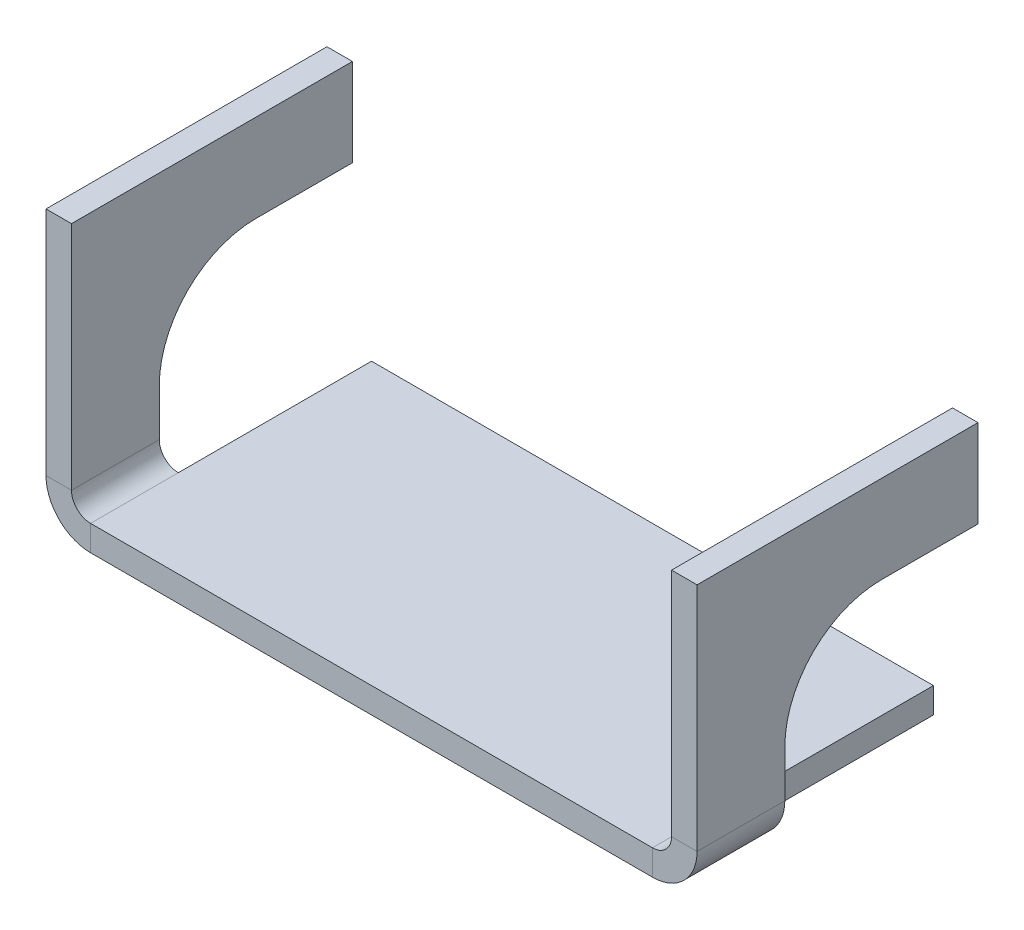
ISO-10303-21;
HEADER;
FILE_DESCRIPTION(('STEP AP214'),'2;1');
FILE_NAME('part.step','',(''),(''),'','','');
FILE_SCHEMA(('AUTOMOTIVE_DESIGN { 1 0 10303 214 1 1 1 1 }'));
ENDSEC;
DATA;
#1=APPLICATION_CONTEXT('core data for automotive mechanical design processes');
#2=APPLICATION_PROTOCOL_DEFINITION('international standard','automotive_design',2000,#1);
#3=PRODUCT_CONTEXT('',#1,'mechanical');
#4=PRODUCT('Part','Part','',(#3));
#5=PRODUCT_RELATED_PRODUCT_CATEGORY('part','',(#4));
#6=PRODUCT_DEFINITION_FORMATION('','',#4);
#7=PRODUCT_DEFINITION_CONTEXT('part definition',#1,'design');
#8=PRODUCT_DEFINITION('design','',#6,#7);
#9=PRODUCT_DEFINITION_SHAPE('','',#8);
#10=(LENGTH_UNIT() NAMED_UNIT(*) SI_UNIT(.MILLI.,.METRE.));
#11=(NAMED_UNIT(*) PLANE_ANGLE_UNIT() SI_UNIT($,.RADIAN.));
#12=(NAMED_UNIT(*) SI_UNIT($,.STERADIAN.) SOLID_ANGLE_UNIT());
#13=UNCERTAINTY_MEASURE_WITH_UNIT(LENGTH_MEASURE(1.E-05),#10,'distance_accuracy_value','');
#14=(GEOMETRIC_REPRESENTATION_CONTEXT(3) GLOBAL_UNCERTAINTY_ASSIGNED_CONTEXT((#13)) GLOBAL_UNIT_ASSIGNED_CONTEXT((#10,
#11,#12)) REPRESENTATION_CONTEXT('',''));
#15=CARTESIAN_POINT('',(0.,0.,0.));
#16=DIRECTION('',(0.,0.,1.));
#17=DIRECTION('',(1.,0.,0.));
#18=AXIS2_PLACEMENT_3D('',#15,#16,#17);
#19=CARTESIAN_POINT('',(47.033,0.,-5.467));
#20=DIRECTION('',(0.,-1.,0.));
#21=DIRECTION('',(0.,0.,-1.));
#22=AXIS2_PLACEMENT_3D('',#19,#20,#21);
#23=PLANE('',#22);
#24=DIRECTION('',(0.,0.,1.));
#25=VECTOR('',#24,1.);
#26=CARTESIAN_POINT('',(-35.,0.,-17.5));
#27=LINE('',#26,#25);
#28=CARTESIAN_POINT('',(-35.,0.,-17.5));
#29=VERTEX_POINT('',#28);
#30=CARTESIAN_POINT('',(-35.,0.,6.566));
#31=VERTEX_POINT('',#30);
#32=EDGE_CURVE('E318',#29,#31,#27,.T.);
#33=ORIENTED_EDGE('',*,*,#32,.T.);
#34=DIRECTION('',(0.,0.,1.));
#35=VECTOR('',#34,1.);
#36=CARTESIAN_POINT('',(-35.,0.,-5.46699999999999));
#37=LINE('',#36,#35);
#38=CARTESIAN_POINT('',(-35.,0.,17.5));
#39=VERTEX_POINT('',#38);
#40=EDGE_CURVE('E61',#31,#39,#37,.T.);
#41=ORIENTED_EDGE('',*,*,#40,.T.);
#42=DIRECTION('',(1.,0.,0.));
#43=VECTOR('',#42,1.);
#44=CARTESIAN_POINT('',(-70.,0.,17.5));
#45=LINE('',#44,#43);
#46=CARTESIAN_POINT('',(35.,0.,17.5));
#47=VERTEX_POINT('',#46);
#48=EDGE_CURVE('E298',#39,#47,#45,.T.);
#49=ORIENTED_EDGE('',*,*,#48,.T.);
#50=DIRECTION('',(0.,0.,1.));
#51=VECTOR('',#50,1.);
#52=CARTESIAN_POINT('',(35.,0.,-5.46700000000001));
#53=LINE('',#52,#51);
#54=CARTESIAN_POINT('',(35.,0.,6.566));
#55=VERTEX_POINT('',#54);
#56=EDGE_CURVE('E77',#55,#47,#53,.T.);
#57=ORIENTED_EDGE('',*,*,#56,.F.);
#58=DIRECTION('',(0.,0.,-1.));
#59=VECTOR('',#58,1.);
#60=CARTESIAN_POINT('',(35.,0.,-17.5));
#61=LINE('',#60,#59);
#62=CARTESIAN_POINT('',(35.,0.,-17.5));
#63=VERTEX_POINT('',#62);
#64=EDGE_CURVE('E312',#55,#63,#61,.T.);
#65=ORIENTED_EDGE('',*,*,#64,.T.);
#66=DIRECTION('',(-1.,0.,0.));
#67=VECTOR('',#66,1.);
#68=CARTESIAN_POINT('',(-35.,0.,-17.5));
#69=LINE('',#68,#67);
#70=EDGE_CURVE('E315',#63,#29,#69,.T.);
#71=ORIENTED_EDGE('',*,*,#70,.T.);
#72=EDGE_LOOP('',(#33,#41,#49,#57,#65,#71));
#73=FACE_BOUND('',#72,.T.);
#74=ADVANCED_FACE('F53',(#73),#23,.F.);
#75=CARTESIAN_POINT('',(47.033,-3.175,-5.467));
#76=DIRECTION('',(0.,-1.,0.));
#77=DIRECTION('',(0.,0.,-1.));
#78=AXIS2_PLACEMENT_3D('',#75,#76,#77);
#79=PLANE('',#78);
#80=DIRECTION('',(0.,0.,1.));
#81=VECTOR('',#80,1.);
#82=CARTESIAN_POINT('',(-35.,-3.175,-5.46699999999999));
#83=LINE('',#82,#81);
#84=CARTESIAN_POINT('',(-35.,-3.175,6.566));
#85=VERTEX_POINT('',#84);
#86=CARTESIAN_POINT('',(-35.,-3.175,17.5));
#87=VERTEX_POINT('',#86);
#88=EDGE_CURVE('E333',#85,#87,#83,.T.);
#89=ORIENTED_EDGE('',*,*,#88,.F.);
#90=DIRECTION('',(0.,0.,1.));
#91=VECTOR('',#90,1.);
#92=CARTESIAN_POINT('',(-35.,-3.175,-17.5));
#93=LINE('',#92,#91);
#94=CARTESIAN_POINT('',(-35.,-3.175,-17.5));
#95=VERTEX_POINT('',#94);
#96=EDGE_CURVE('E308',#95,#85,#93,.T.);
#97=ORIENTED_EDGE('',*,*,#96,.F.);
#98=DIRECTION('',(-1.,0.,0.));
#99=VECTOR('',#98,1.);
#100=CARTESIAN_POINT('',(-35.,-3.175,-17.5));
#101=LINE('',#100,#99);
#102=CARTESIAN_POINT('',(35.,-3.175,-17.5));
#103=VERTEX_POINT('',#102);
#104=EDGE_CURVE('E305',#103,#95,#101,.T.);
#105=ORIENTED_EDGE('',*,*,#104,.F.);
#106=DIRECTION('',(0.,0.,-1.));
#107=VECTOR('',#106,1.);
#108=CARTESIAN_POINT('',(35.,-3.175,-17.5));
#109=LINE('',#108,#107);
#110=CARTESIAN_POINT('',(35.,-3.175,6.566));
#111=VERTEX_POINT('',#110);
#112=EDGE_CURVE('E302',#111,#103,#109,.T.);
#113=ORIENTED_EDGE('',*,*,#112,.F.);
#114=DIRECTION('',(0.,0.,1.));
#115=VECTOR('',#114,1.);
#116=CARTESIAN_POINT('',(35.,-3.175,-5.46700000000001));
#117=LINE('',#116,#115);
#118=CARTESIAN_POINT('',(35.,-3.175,17.5));
#119=VERTEX_POINT('',#118);
#120=EDGE_CURVE('E323',#111,#119,#117,.T.);
#121=ORIENTED_EDGE('',*,*,#120,.T.);
#122=DIRECTION('',(1.,0.,0.));
#123=VECTOR('',#122,1.);
#124=CARTESIAN_POINT('',(-70.,-3.175,17.5));
#125=LINE('',#124,#123);
#126=EDGE_CURVE('E56',#87,#119,#125,.T.);
#127=ORIENTED_EDGE('',*,*,#126,.F.);
#128=EDGE_LOOP('',(#89,#97,#105,#113,#121,#127));
#129=FACE_BOUND('',#128,.T.);
#130=ADVANCED_FACE('F387',(#129),#79,.T.);
#131=CARTESIAN_POINT('',(-70.,-3.175,17.5));
#132=DIRECTION('',(0.,0.,1.));
#133=DIRECTION('',(1.,0.,0.));
#134=AXIS2_PLACEMENT_3D('',#131,#132,#133);
#135=PLANE('',#134);
#136=DIRECTION('',(0.,1.,0.));
#137=VECTOR('',#136,1.);
#138=CARTESIAN_POINT('',(-35.,-3.175,17.5));
#139=LINE('',#138,#137);
#140=EDGE_CURVE('E335',#87,#39,#139,.T.);
#141=ORIENTED_EDGE('',*,*,#140,.F.);
#142=ORIENTED_EDGE('',*,*,#126,.T.);
#143=DIRECTION('',(0.,1.,0.));
#144=VECTOR('',#143,1.);
#145=CARTESIAN_POINT('',(35.,-3.175,17.5));
#146=LINE('',#145,#144);
#147=EDGE_CURVE('E330',#119,#47,#146,.T.);
#148=ORIENTED_EDGE('',*,*,#147,.T.);
#149=ORIENTED_EDGE('',*,*,#48,.F.);
#150=EDGE_LOOP('',(#141,#142,#148,#149));
#151=FACE_BOUND('',#150,.T.);
#152=ADVANCED_FACE('F344',(#151),#135,.T.);
#153=CARTESIAN_POINT('',(-35.,-3.175,-17.5));
#154=DIRECTION('',(-1.,0.,0.));
#155=DIRECTION('',(0.,0.,1.));
#156=AXIS2_PLACEMENT_3D('',#153,#154,#155);
#157=PLANE('',#156);
#158=ORIENTED_EDGE('',*,*,#32,.F.);
#159=DIRECTION('',(0.,1.,0.));
#160=VECTOR('',#159,1.);
#161=CARTESIAN_POINT('',(-35.,-3.175,-17.5));
#162=LINE('',#161,#160);
#163=EDGE_CURVE('E321',#95,#29,#162,.T.);
#164=ORIENTED_EDGE('',*,*,#163,.F.);
#165=ORIENTED_EDGE('',*,*,#96,.T.);
#166=DIRECTION('',(0.,1.,0.));
#167=VECTOR('',#166,1.);
#168=CARTESIAN_POINT('',(-35.,-3.175,6.566));
#169=LINE('',#168,#167);
#170=EDGE_CURVE('E12',#85,#31,#169,.T.);
#171=ORIENTED_EDGE('',*,*,#170,.T.);
#172=EDGE_LOOP('',(#158,#164,#165,#171));
#173=FACE_BOUND('',#172,.T.);
#174=ADVANCED_FACE('F378',(#173),#157,.T.);
#175=CARTESIAN_POINT('',(-35.,-3.175,-17.5));
#176=DIRECTION('',(0.,0.,-1.));
#177=DIRECTION('',(-1.,0.,0.));
#178=AXIS2_PLACEMENT_3D('',#175,#176,#177);
#179=PLANE('',#178);
#180=ORIENTED_EDGE('',*,*,#70,.F.);
#181=DIRECTION('',(0.,1.,0.));
#182=VECTOR('',#181,1.);
#183=CARTESIAN_POINT('',(35.,-3.175,-17.5));
#184=LINE('',#183,#182);
#185=EDGE_CURVE('E311',#103,#63,#184,.T.);
#186=ORIENTED_EDGE('',*,*,#185,.F.);
#187=ORIENTED_EDGE('',*,*,#104,.T.);
#188=ORIENTED_EDGE('',*,*,#163,.T.);
#189=EDGE_LOOP('',(#180,#186,#187,#188));
#190=FACE_BOUND('',#189,.T.);
#191=ADVANCED_FACE('F374',(#190),#179,.T.);
#192=CARTESIAN_POINT('',(35.,-3.175,-17.5));
#193=DIRECTION('',(1.,0.,0.));
#194=DIRECTION('',(0.,0.,-1.));
#195=AXIS2_PLACEMENT_3D('',#192,#193,#194);
#196=PLANE('',#195);
#197=ORIENTED_EDGE('',*,*,#64,.F.);
#198=DIRECTION('',(0.,1.,0.));
#199=VECTOR('',#198,1.);
#200=CARTESIAN_POINT('',(35.,-3.175,6.566));
#201=LINE('',#200,#199);
#202=EDGE_CURVE('E327',#111,#55,#201,.T.);
#203=ORIENTED_EDGE('',*,*,#202,.F.);
#204=ORIENTED_EDGE('',*,*,#112,.T.);
#205=ORIENTED_EDGE('',*,*,#185,.T.);
#206=EDGE_LOOP('',(#197,#203,#204,#205));
#207=FACE_BOUND('',#206,.T.);
#208=ADVANCED_FACE('F370',(#207),#196,.T.);
#209=CARTESIAN_POINT('',(35.,2.380000066,6.566));
#210=DIRECTION('',(0.,0.,-1.));
#211=DIRECTION('',(-1.,0.,0.));
#212=AXIS2_PLACEMENT_3D('',#209,#210,#211);
#213=PLANE('',#212);
#214=ORIENTED_EDGE('',*,*,#202,.T.);
#215=CARTESIAN_POINT('',(35.,2.380000066,6.566));
#216=DIRECTION('',(0.,0.,1.));
#217=DIRECTION('',(1.,0.,0.));
#218=AXIS2_PLACEMENT_3D('',#215,#216,#217);
#219=CIRCLE('',#218,2.380000066);
#220=CARTESIAN_POINT('',(37.380000066,2.380000066,6.566));
#221=VERTEX_POINT('',#220);
#222=EDGE_CURVE('E238',#55,#221,#219,.T.);
#223=ORIENTED_EDGE('',*,*,#222,.T.);
#224=DIRECTION('',(1.,0.,0.));
#225=VECTOR('',#224,1.);
#226=CARTESIAN_POINT('',(40.555000066,2.38000006600002,6.566));
#227=LINE('',#226,#225);
#228=CARTESIAN_POINT('',(40.555000066,2.38000006600002,6.566));
#229=VERTEX_POINT('',#228);
#230=EDGE_CURVE('E283',#221,#229,#227,.T.);
#231=ORIENTED_EDGE('',*,*,#230,.T.);
#232=CARTESIAN_POINT('',(35.,2.380000066,6.566));
#233=DIRECTION('',(0.,0.,1.));
#234=DIRECTION('',(-1.,0.,0.));
#235=AXIS2_PLACEMENT_3D('',#232,#233,#234);
#236=CIRCLE('',#235,5.555000066);
#237=EDGE_CURVE('E291',#111,#229,#236,.T.);
#238=ORIENTED_EDGE('',*,*,#237,.F.);
#239=EDGE_LOOP('',(#214,#223,#231,#238));
#240=FACE_BOUND('',#239,.T.);
#241=ADVANCED_FACE('F365',(#240),#213,.T.);
#242=CARTESIAN_POINT('',(35.,2.380000066,17.5));
#243=DIRECTION('',(0.,0.,1.));
#244=DIRECTION('',(1.,0.,0.));
#245=AXIS2_PLACEMENT_3D('',#242,#243,#244);
#246=PLANE('',#245);
#247=DIRECTION('',(-1.,0.,0.));
#248=VECTOR('',#247,1.);
#249=CARTESIAN_POINT('',(40.555000066,2.38000006600002,17.5));
#250=LINE('',#249,#248);
#251=CARTESIAN_POINT('',(40.555000066,2.38000006600001,17.5));
#252=VERTEX_POINT('',#251);
#253=CARTESIAN_POINT('',(37.380000066,2.380000066,17.5));
#254=VERTEX_POINT('',#253);
#255=EDGE_CURVE('E286',#252,#254,#250,.T.);
#256=ORIENTED_EDGE('',*,*,#255,.T.);
#257=CARTESIAN_POINT('',(35.,2.380000066,17.5));
#258=DIRECTION('',(0.,0.,1.));
#259=DIRECTION('',(1.,0.,0.));
#260=AXIS2_PLACEMENT_3D('',#257,#258,#259);
#261=CIRCLE('',#260,2.380000066);
#262=EDGE_CURVE('E295',#254,#47,#261,.F.);
#263=ORIENTED_EDGE('',*,*,#262,.T.);
#264=ORIENTED_EDGE('',*,*,#147,.F.);
#265=CARTESIAN_POINT('',(35.,2.380000066,17.5));
#266=DIRECTION('',(0.,0.,-1.));
#267=DIRECTION('',(1.,0.,0.));
#268=AXIS2_PLACEMENT_3D('',#265,#266,#267);
#269=CIRCLE('',#268,5.555000066);
#270=EDGE_CURVE('E294',#252,#119,#269,.T.);
#271=ORIENTED_EDGE('',*,*,#270,.F.);
#272=EDGE_LOOP('',(#256,#263,#264,#271));
#273=FACE_BOUND('',#272,.T.);
#274=ADVANCED_FACE('F348',(#273),#246,.T.);
#275=CARTESIAN_POINT('',(35.,2.380000066,-0.946694981119614));
#276=DIRECTION('',(0.,0.,1.));
#277=DIRECTION('',(1.,0.,0.));
#278=AXIS2_PLACEMENT_3D('',#275,#276,#277);
#279=CYLINDRICAL_SURFACE('',#278,5.555000066);
#280=ORIENTED_EDGE('',*,*,#270,.T.);
#281=ORIENTED_EDGE('',*,*,#120,.F.);
#282=ORIENTED_EDGE('',*,*,#237,.T.);
#283=DIRECTION('',(0.,0.,1.));
#284=VECTOR('',#283,1.);
#285=CARTESIAN_POINT('',(40.555000066,2.38000006600002,-5.46700000000001));
#286=LINE('',#285,#284);
#287=EDGE_CURVE('E231',#229,#252,#286,.T.);
#288=ORIENTED_EDGE('',*,*,#287,.T.);
#289=EDGE_LOOP('',(#280,#281,#282,#288));
#290=FACE_BOUND('',#289,.T.);
#291=ADVANCED_FACE('F351',(#290),#279,.T.);
#292=CARTESIAN_POINT('',(35.,2.380000066,-0.946694981119614));
#293=DIRECTION('',(0.,0.,1.));
#294=DIRECTION('',(1.,0.,0.));
#295=AXIS2_PLACEMENT_3D('',#292,#293,#294);
#296=CYLINDRICAL_SURFACE('',#295,2.380000066);
#297=ORIENTED_EDGE('',*,*,#262,.F.);
#298=DIRECTION('',(0.,0.,1.));
#299=VECTOR('',#298,1.);
#300=CARTESIAN_POINT('',(37.380000066,2.380000066,-5.46700000000001));
#301=LINE('',#300,#299);
#302=EDGE_CURVE('E255',#221,#254,#301,.T.);
#303=ORIENTED_EDGE('',*,*,#302,.F.);
#304=ORIENTED_EDGE('',*,*,#222,.F.);
#305=ORIENTED_EDGE('',*,*,#56,.T.);
#306=EDGE_LOOP('',(#297,#303,#304,#305));
#307=FACE_BOUND('',#306,.T.);
#308=ADVANCED_FACE('F368',(#307),#296,.F.);
#309=CARTESIAN_POINT('',(40.5550000659999,31.1478655357687,-17.5));
#310=DIRECTION('',(0.,1.,0.));
#311=DIRECTION('',(0.,0.,-1.));
#312=AXIS2_PLACEMENT_3D('',#309,#310,#311);
#313=PLANE('',#312);
#314=DIRECTION('',(0.,0.,-1.));
#315=VECTOR('',#314,1.);
#316=CARTESIAN_POINT('',(37.3800000659999,31.1478655357687,-17.5));
#317=LINE('',#316,#315);
#318=CARTESIAN_POINT('',(37.3800000659999,31.1478655357687,17.5));
#319=VERTEX_POINT('',#318);
#320=CARTESIAN_POINT('',(37.3800000659999,31.1478655357687,-17.5));
#321=VERTEX_POINT('',#320);
#322=EDGE_CURVE('E250',#319,#321,#317,.T.);
#323=ORIENTED_EDGE('',*,*,#322,.F.);
#324=DIRECTION('',(-1.,0.,0.));
#325=VECTOR('',#324,1.);
#326=CARTESIAN_POINT('',(40.5550000659999,31.1478655357687,17.5));
#327=LINE('',#326,#325);
#328=CARTESIAN_POINT('',(40.5550000659999,31.1478655357687,17.5));
#329=VERTEX_POINT('',#328);
#330=EDGE_CURVE('E235',#329,#319,#327,.T.);
#331=ORIENTED_EDGE('',*,*,#330,.F.);
#332=DIRECTION('',(0.,0.,-1.));
#333=VECTOR('',#332,1.);
#334=CARTESIAN_POINT('',(40.5550000659999,31.1478655357687,-17.5));
#335=LINE('',#334,#333);
#336=CARTESIAN_POINT('',(40.5550000659999,31.1478655357687,-17.5));
#337=VERTEX_POINT('',#336);
#338=EDGE_CURVE('E280',#329,#337,#335,.T.);
#339=ORIENTED_EDGE('',*,*,#338,.T.);
#340=DIRECTION('',(-1.,0.,0.));
#341=VECTOR('',#340,1.);
#342=CARTESIAN_POINT('',(40.5550000659999,31.1478655357687,-17.5));
#343=LINE('',#342,#341);
#344=EDGE_CURVE('E278',#337,#321,#343,.T.);
#345=ORIENTED_EDGE('',*,*,#344,.T.);
#346=EDGE_LOOP('',(#323,#331,#339,#345));
#347=FACE_BOUND('',#346,.T.);
#348=ADVANCED_FACE('F474',(#347),#313,.T.);
#349=CARTESIAN_POINT('',(40.5550000659999,20.2138655357687,-17.5));
#350=DIRECTION('',(0.,0.,-1.));
#351=DIRECTION('',(0.,-1.,0.));
#352=AXIS2_PLACEMENT_3D('',#349,#350,#351);
#353=PLANE('',#352);
#354=DIRECTION('',(0.,-1.,0.));
#355=VECTOR('',#354,1.);
#356=CARTESIAN_POINT('',(37.3800000659999,20.2138655357687,-17.5));
#357=LINE('',#356,#355);
#358=CARTESIAN_POINT('',(37.3800000659999,20.2138655357687,-17.5));
#359=VERTEX_POINT('',#358);
#360=EDGE_CURVE('E247',#321,#359,#357,.T.);
#361=ORIENTED_EDGE('',*,*,#360,.F.);
#362=ORIENTED_EDGE('',*,*,#344,.F.);
#363=DIRECTION('',(0.,-1.,0.));
#364=VECTOR('',#363,1.);
#365=CARTESIAN_POINT('',(40.5550000659999,20.2138655357687,-17.5));
#366=LINE('',#365,#364);
#367=CARTESIAN_POINT('',(40.5550000659999,20.2138655357687,-17.5));
#368=VERTEX_POINT('',#367);
#369=EDGE_CURVE('E275',#337,#368,#366,.T.);
#370=ORIENTED_EDGE('',*,*,#369,.T.);
#371=DIRECTION('',(-1.,0.,0.));
#372=VECTOR('',#371,1.);
#373=CARTESIAN_POINT('',(40.5550000659999,20.2138655357687,-17.5));
#374=LINE('',#373,#372);
#375=EDGE_CURVE('E273',#368,#359,#374,.T.);
#376=ORIENTED_EDGE('',*,*,#375,.T.);
#377=EDGE_LOOP('',(#361,#362,#370,#376));
#378=FACE_BOUND('',#377,.T.);
#379=ADVANCED_FACE('F496',(#378),#353,.T.);
#380=CARTESIAN_POINT('',(40.5550000659999,20.2138655357687,-17.5));
#381=DIRECTION('',(0.,-1.,0.));
#382=DIRECTION('',(0.,0.,1.));
#383=AXIS2_PLACEMENT_3D('',#380,#381,#382);
#384=PLANE('',#383);
#385=DIRECTION('',(0.,0.,1.));
#386=VECTOR('',#385,1.);
#387=CARTESIAN_POINT('',(37.3800000659999,20.2138655357687,-17.5));
#388=LINE('',#387,#386);
#389=CARTESIAN_POINT('',(37.3800000659999,20.2138655357687,-5.46700000000001));
#390=VERTEX_POINT('',#389);
#391=EDGE_CURVE('E244',#359,#390,#388,.T.);
#392=ORIENTED_EDGE('',*,*,#391,.F.);
#393=ORIENTED_EDGE('',*,*,#375,.F.);
#394=DIRECTION('',(0.,0.,1.));
#395=VECTOR('',#394,1.);
#396=CARTESIAN_POINT('',(40.5550000659999,20.2138655357687,-17.5));
#397=LINE('',#396,#395);
#398=CARTESIAN_POINT('',(40.5550000659999,20.2138655357687,-5.46700000000001));
#399=VERTEX_POINT('',#398);
#400=EDGE_CURVE('E270',#368,#399,#397,.T.);
#401=ORIENTED_EDGE('',*,*,#400,.T.);
#402=DIRECTION('',(-1.,0.,0.));
#403=VECTOR('',#402,1.);
#404=CARTESIAN_POINT('',(40.5550000659999,20.2138655357687,-5.46700000000001));
#405=LINE('',#404,#403);
#406=EDGE_CURVE('E268',#399,#390,#405,.T.);
#407=ORIENTED_EDGE('',*,*,#406,.T.);
#408=EDGE_LOOP('',(#392,#393,#401,#407));
#409=FACE_BOUND('',#408,.T.);
#410=ADVANCED_FACE('F492',(#409),#384,.T.);
#411=CARTESIAN_POINT('',(40.555000066,8.1808655357687,-5.46700000000001));
#412=DIRECTION('',(-1.,0.,0.));
#413=DIRECTION('',(0.,0.,1.));
#414=AXIS2_PLACEMENT_3D('',#411,#412,#413);
#415=CYLINDRICAL_SURFACE('',#414,12.033);
#416=CARTESIAN_POINT('',(37.380000066,8.18086553576869,-5.46700000000001));
#417=DIRECTION('',(1.,0.,0.));
#418=DIRECTION('',(0.,0.,-1.));
#419=AXIS2_PLACEMENT_3D('',#416,#417,#418);
#420=CIRCLE('',#419,12.033);
#421=CARTESIAN_POINT('',(37.380000066,8.18086553576869,6.56599999999999));
#422=VERTEX_POINT('',#421);
#423=EDGE_CURVE('E241',#390,#422,#420,.T.);
#424=ORIENTED_EDGE('',*,*,#423,.F.);
#425=ORIENTED_EDGE('',*,*,#406,.F.);
#426=CARTESIAN_POINT('',(40.555000066,8.1808655357687,-5.46700000000001));
#427=DIRECTION('',(1.,0.,0.));
#428=DIRECTION('',(0.,0.,-1.));
#429=AXIS2_PLACEMENT_3D('',#426,#427,#428);
#430=CIRCLE('',#429,12.033);
#431=CARTESIAN_POINT('',(40.555000066,8.1808655357687,6.566));
#432=VERTEX_POINT('',#431);
#433=EDGE_CURVE('E265',#399,#432,#430,.T.);
#434=ORIENTED_EDGE('',*,*,#433,.T.);
#435=DIRECTION('',(-1.,0.,0.));
#436=VECTOR('',#435,1.);
#437=CARTESIAN_POINT('',(40.555000066,8.1808655357687,6.566));
#438=LINE('',#437,#436);
#439=EDGE_CURVE('E263',#432,#422,#438,.T.);
#440=ORIENTED_EDGE('',*,*,#439,.T.);
#441=EDGE_LOOP('',(#424,#425,#434,#440));
#442=FACE_BOUND('',#441,.T.);
#443=ADVANCED_FACE('F489',(#442),#415,.F.);
#444=CARTESIAN_POINT('',(40.555000066,8.1808655357687,-5.46700000000001));
#445=DIRECTION('',(1.,0.,0.));
#446=DIRECTION('',(0.,0.,-1.));
#447=AXIS2_PLACEMENT_3D('',#444,#445,#446);
#448=PLANE('',#447);
#449=ORIENTED_EDGE('',*,*,#287,.F.);
#450=DIRECTION('',(0.,-1.,0.));
#451=VECTOR('',#450,1.);
#452=CARTESIAN_POINT('',(40.555000066,-3.8521344642313,6.566));
#453=LINE('',#452,#451);
#454=EDGE_CURVE('E260',#432,#229,#453,.T.);
#455=ORIENTED_EDGE('',*,*,#454,.F.);
#456=ORIENTED_EDGE('',*,*,#433,.F.);
#457=ORIENTED_EDGE('',*,*,#400,.F.);
#458=ORIENTED_EDGE('',*,*,#369,.F.);
#459=ORIENTED_EDGE('',*,*,#338,.F.);
#460=DIRECTION('',(0.,1.,0.));
#461=VECTOR('',#460,1.);
#462=CARTESIAN_POINT('',(40.5550000660004,-108.852134464231,17.5));
#463=LINE('',#462,#461);
#464=EDGE_CURVE('E239',#252,#329,#463,.T.);
#465=ORIENTED_EDGE('',*,*,#464,.F.);
#466=EDGE_LOOP('',(#449,#455,#456,#457,#458,#459,#465));
#467=FACE_BOUND('',#466,.T.);
#468=ADVANCED_FACE('F356',(#467),#448,.T.);
#469=CARTESIAN_POINT('',(40.555000066,-3.8521344642313,6.566));
#470=DIRECTION('',(0.,0.,-1.));
#471=DIRECTION('',(0.,-1.,0.));
#472=AXIS2_PLACEMENT_3D('',#469,#470,#471);
#473=PLANE('',#472);
#474=ORIENTED_EDGE('',*,*,#230,.F.);
#475=DIRECTION('',(0.,-1.,0.));
#476=VECTOR('',#475,1.);
#477=CARTESIAN_POINT('',(37.380000066,-3.85213446423131,6.566));
#478=LINE('',#477,#476);
#479=EDGE_CURVE('E258',#422,#221,#478,.T.);
#480=ORIENTED_EDGE('',*,*,#479,.F.);
#481=ORIENTED_EDGE('',*,*,#439,.F.);
#482=ORIENTED_EDGE('',*,*,#454,.T.);
#483=EDGE_LOOP('',(#474,#480,#481,#482));
#484=FACE_BOUND('',#483,.T.);
#485=ADVANCED_FACE('F361',(#484),#473,.T.);
#486=CARTESIAN_POINT('',(37.380000066,8.18086553576869,-5.46700000000001));
#487=DIRECTION('',(1.,0.,0.));
#488=DIRECTION('',(0.,0.,-1.));
#489=AXIS2_PLACEMENT_3D('',#486,#487,#488);
#490=PLANE('',#489);
#491=ORIENTED_EDGE('',*,*,#479,.T.);
#492=ORIENTED_EDGE('',*,*,#302,.T.);
#493=DIRECTION('',(0.,1.,0.));
#494=VECTOR('',#493,1.);
#495=CARTESIAN_POINT('',(37.3800000660004,-108.852134464231,17.5));
#496=LINE('',#495,#494);
#497=EDGE_CURVE('E253',#254,#319,#496,.T.);
#498=ORIENTED_EDGE('',*,*,#497,.T.);
#499=ORIENTED_EDGE('',*,*,#322,.T.);
#500=ORIENTED_EDGE('',*,*,#360,.T.);
#501=ORIENTED_EDGE('',*,*,#391,.T.);
#502=ORIENTED_EDGE('',*,*,#423,.T.);
#503=EDGE_LOOP('',(#491,#492,#498,#499,#500,#501,#502));
#504=FACE_BOUND('',#503,.T.);
#505=ADVANCED_FACE('F480',(#504),#490,.F.);
#506=CARTESIAN_POINT('',(40.5550000660004,-108.852134464231,17.5));
#507=DIRECTION('',(0.,0.,1.));
#508=DIRECTION('',(0.,1.,0.));
#509=AXIS2_PLACEMENT_3D('',#506,#507,#508);
#510=PLANE('',#509);
#511=ORIENTED_EDGE('',*,*,#255,.F.);
#512=ORIENTED_EDGE('',*,*,#464,.T.);
#513=ORIENTED_EDGE('',*,*,#330,.T.);
#514=ORIENTED_EDGE('',*,*,#497,.F.);
#515=EDGE_LOOP('',(#511,#512,#513,#514));
#516=FACE_BOUND('',#515,.T.);
#517=ADVANCED_FACE('F477',(#516),#510,.T.);
#518=CARTESIAN_POINT('',(-35.,2.380000066,6.566));
#519=DIRECTION('',(0.,0.,-1.));
#520=DIRECTION('',(-1.,0.,0.));
#521=AXIS2_PLACEMENT_3D('',#518,#519,#520);
#522=PLANE('',#521);
#523=DIRECTION('',(-1.,0.,0.));
#524=VECTOR('',#523,1.);
#525=CARTESIAN_POINT('',(-40.555000066,2.38000006600002,6.566));
#526=LINE('',#525,#524);
#527=CARTESIAN_POINT('',(-37.380000066,2.380000066,6.566));
#528=VERTEX_POINT('',#527);
#529=CARTESIAN_POINT('',(-40.555000066,2.38000006600001,6.566));
#530=VERTEX_POINT('',#529);
#531=EDGE_CURVE('E199',#528,#530,#526,.T.);
#532=ORIENTED_EDGE('',*,*,#531,.F.);
#533=CARTESIAN_POINT('',(-35.,2.380000066,6.566));
#534=DIRECTION('',(0.,0.,-1.));
#535=DIRECTION('',(-1.,0.,0.));
#536=AXIS2_PLACEMENT_3D('',#533,#534,#535);
#537=CIRCLE('',#536,2.380000066);
#538=EDGE_CURVE('E69',#528,#31,#537,.F.);
#539=ORIENTED_EDGE('',*,*,#538,.T.);
#540=ORIENTED_EDGE('',*,*,#170,.F.);
#541=CARTESIAN_POINT('',(-35.,2.380000066,6.566));
#542=DIRECTION('',(0.,0.,1.));
#543=DIRECTION('',(-1.,0.,0.));
#544=AXIS2_PLACEMENT_3D('',#541,#542,#543);
#545=CIRCLE('',#544,5.555000066);
#546=EDGE_CURVE('E224',#530,#85,#545,.T.);
#547=ORIENTED_EDGE('',*,*,#546,.F.);
#548=EDGE_LOOP('',(#532,#539,#540,#547));
#549=FACE_BOUND('',#548,.T.);
#550=ADVANCED_FACE('F380',(#549),#522,.T.);
#551=CARTESIAN_POINT('',(-35.,2.380000066,17.5));
#552=DIRECTION('',(0.,0.,1.));
#553=DIRECTION('',(1.,0.,0.));
#554=AXIS2_PLACEMENT_3D('',#551,#552,#553);
#555=PLANE('',#554);
#556=CARTESIAN_POINT('',(-35.,2.380000066,17.5));
#557=DIRECTION('',(0.,0.,-1.));
#558=DIRECTION('',(-1.,0.,0.));
#559=AXIS2_PLACEMENT_3D('',#556,#557,#558);
#560=CIRCLE('',#559,2.380000066);
#561=CARTESIAN_POINT('',(-37.380000066,2.38000006600001,17.5));
#562=VERTEX_POINT('',#561);
#563=EDGE_CURVE('E228',#39,#562,#560,.T.);
#564=ORIENTED_EDGE('',*,*,#563,.T.);
#565=DIRECTION('',(1.,0.,0.));
#566=VECTOR('',#565,1.);
#567=CARTESIAN_POINT('',(-40.555000066,2.38000006600002,17.5));
#568=LINE('',#567,#566);
#569=CARTESIAN_POINT('',(-40.555000066,2.38000006600002,17.5));
#570=VERTEX_POINT('',#569);
#571=EDGE_CURVE('E415',#570,#562,#568,.T.);
#572=ORIENTED_EDGE('',*,*,#571,.F.);
#573=CARTESIAN_POINT('',(-35.,2.380000066,17.5));
#574=DIRECTION('',(0.,0.,-1.));
#575=DIRECTION('',(1.,0.,0.));
#576=AXIS2_PLACEMENT_3D('',#573,#574,#575);
#577=CIRCLE('',#576,5.555000066);
#578=EDGE_CURVE('E227',#87,#570,#577,.T.);
#579=ORIENTED_EDGE('',*,*,#578,.F.);
#580=ORIENTED_EDGE('',*,*,#140,.T.);
#581=EDGE_LOOP('',(#564,#572,#579,#580));
#582=FACE_BOUND('',#581,.T.);
#583=ADVANCED_FACE('F390',(#582),#555,.T.);
#584=CARTESIAN_POINT('',(-35.,2.380000066,25.0126949811196));
#585=DIRECTION('',(0.,0.,-1.));
#586=DIRECTION('',(-1.,0.,0.));
#587=AXIS2_PLACEMENT_3D('',#584,#585,#586);
#588=CYLINDRICAL_SURFACE('',#587,5.555000066);
#589=ORIENTED_EDGE('',*,*,#88,.T.);
#590=ORIENTED_EDGE('',*,*,#578,.T.);
#591=DIRECTION('',(0.,0.,1.));
#592=VECTOR('',#591,1.);
#593=CARTESIAN_POINT('',(-40.555000066,2.38000006600002,-5.467));
#594=LINE('',#593,#592);
#595=EDGE_CURVE('E385',#530,#570,#594,.T.);
#596=ORIENTED_EDGE('',*,*,#595,.F.);
#597=ORIENTED_EDGE('',*,*,#546,.T.);
#598=EDGE_LOOP('',(#589,#590,#596,#597));
#599=FACE_BOUND('',#598,.T.);
#600=ADVANCED_FACE('F383',(#599),#588,.T.);
#601=CARTESIAN_POINT('',(-35.,2.380000066,25.0126949811196));
#602=DIRECTION('',(0.,0.,-1.));
#603=DIRECTION('',(-1.,0.,0.));
#604=AXIS2_PLACEMENT_3D('',#601,#602,#603);
#605=CYLINDRICAL_SURFACE('',#604,2.380000066);
#606=ORIENTED_EDGE('',*,*,#40,.F.);
#607=ORIENTED_EDGE('',*,*,#538,.F.);
#608=DIRECTION('',(0.,0.,1.));
#609=VECTOR('',#608,1.);
#610=CARTESIAN_POINT('',(-37.380000066,2.380000066,-5.467));
#611=LINE('',#610,#609);
#612=EDGE_CURVE('E217',#528,#562,#611,.T.);
#613=ORIENTED_EDGE('',*,*,#612,.T.);
#614=ORIENTED_EDGE('',*,*,#563,.F.);
#615=EDGE_LOOP('',(#606,#607,#613,#614));
#616=FACE_BOUND('',#615,.T.);
#617=ADVANCED_FACE('F393',(#616),#605,.F.);
#618=CARTESIAN_POINT('',(-40.555000066,8.1808655357687,-5.46700000000001));
#619=DIRECTION('',(1.,0.,0.));
#620=DIRECTION('',(0.,0.,1.));
#621=AXIS2_PLACEMENT_3D('',#618,#619,#620);
#622=CYLINDRICAL_SURFACE('',#621,12.033);
#623=CARTESIAN_POINT('',(-37.380000066,8.18086553576869,-5.46700000000001));
#624=DIRECTION('',(-1.,0.,0.));
#625=DIRECTION('',(0.,0.,1.));
#626=AXIS2_PLACEMENT_3D('',#623,#624,#625);
#627=CIRCLE('',#626,12.033);
#628=CARTESIAN_POINT('',(-37.380000066,8.18086553576869,6.566));
#629=VERTEX_POINT('',#628);
#630=CARTESIAN_POINT('',(-37.3800000659999,20.2138655357687,-5.46700000000001));
#631=VERTEX_POINT('',#630);
#632=EDGE_CURVE('E209',#629,#631,#627,.T.);
#633=ORIENTED_EDGE('',*,*,#632,.F.);
#634=DIRECTION('',(1.,0.,0.));
#635=VECTOR('',#634,1.);
#636=CARTESIAN_POINT('',(-40.555000066,8.1808655357687,6.566));
#637=LINE('',#636,#635);
#638=CARTESIAN_POINT('',(-40.555000066,8.1808655357687,6.566));
#639=VERTEX_POINT('',#638);
#640=EDGE_CURVE('E197',#639,#629,#637,.T.);
#641=ORIENTED_EDGE('',*,*,#640,.F.);
#642=CARTESIAN_POINT('',(-40.555000066,8.1808655357687,-5.46700000000001));
#643=DIRECTION('',(-1.,0.,0.));
#644=DIRECTION('',(0.,0.,1.));
#645=AXIS2_PLACEMENT_3D('',#642,#643,#644);
#646=CIRCLE('',#645,12.033);
#647=CARTESIAN_POINT('',(-40.5550000659999,20.2138655357687,-5.46700000000001));
#648=VERTEX_POINT('',#647);
#649=EDGE_CURVE('E207',#639,#648,#646,.T.);
#650=ORIENTED_EDGE('',*,*,#649,.T.);
#651=DIRECTION('',(1.,0.,0.));
#652=VECTOR('',#651,1.);
#653=CARTESIAN_POINT('',(-40.5550000659999,20.2138655357687,-5.46700000000001));
#654=LINE('',#653,#652);
#655=EDGE_CURVE('E216',#648,#631,#654,.T.);
#656=ORIENTED_EDGE('',*,*,#655,.T.);
#657=EDGE_LOOP('',(#633,#641,#650,#656));
#658=FACE_BOUND('',#657,.T.);
#659=ADVANCED_FACE('F206',(#658),#622,.F.);
#660=CARTESIAN_POINT('',(-40.5550000659999,20.2138655357687,-17.5));
#661=DIRECTION('',(0.,-1.,0.));
#662=DIRECTION('',(0.,0.,-1.));
#663=AXIS2_PLACEMENT_3D('',#660,#661,#662);
#664=PLANE('',#663);
#665=DIRECTION('',(0.,0.,-1.));
#666=VECTOR('',#665,1.);
#667=CARTESIAN_POINT('',(-37.3800000659999,20.2138655357687,-17.5));
#668=LINE('',#667,#666);
#669=CARTESIAN_POINT('',(-37.3800000659999,20.2138655357687,-17.5));
#670=VERTEX_POINT('',#669);
#671=EDGE_CURVE('E410',#631,#670,#668,.T.);
#672=ORIENTED_EDGE('',*,*,#671,.F.);
#673=ORIENTED_EDGE('',*,*,#655,.F.);
#674=DIRECTION('',(0.,0.,-1.));
#675=VECTOR('',#674,1.);
#676=CARTESIAN_POINT('',(-40.5550000659999,20.2138655357687,-17.5));
#677=LINE('',#676,#675);
#678=CARTESIAN_POINT('',(-40.5550000659999,20.2138655357687,-17.5));
#679=VERTEX_POINT('',#678);
#680=EDGE_CURVE('E215',#648,#679,#677,.T.);
#681=ORIENTED_EDGE('',*,*,#680,.T.);
#682=DIRECTION('',(1.,0.,0.));
#683=VECTOR('',#682,1.);
#684=CARTESIAN_POINT('',(-40.5550000659999,20.2138655357687,-17.5));
#685=LINE('',#684,#683);
#686=EDGE_CURVE('E431',#679,#670,#685,.T.);
#687=ORIENTED_EDGE('',*,*,#686,.T.);
#688=EDGE_LOOP('',(#672,#673,#681,#687));
#689=FACE_BOUND('',#688,.T.);
#690=ADVANCED_FACE('F434',(#689),#664,.T.);
#691=CARTESIAN_POINT('',(-40.5550000659999,31.1478655357687,-17.5));
#692=DIRECTION('',(0.,0.,-1.));
#693=DIRECTION('',(0.,1.,0.));
#694=AXIS2_PLACEMENT_3D('',#691,#692,#693);
#695=PLANE('',#694);
#696=DIRECTION('',(0.,1.,0.));
#697=VECTOR('',#696,1.);
#698=CARTESIAN_POINT('',(-37.3800000659999,31.1478655357687,-17.5));
#699=LINE('',#698,#697);
#700=CARTESIAN_POINT('',(-37.3800000659999,31.1478655357687,-17.5));
#701=VERTEX_POINT('',#700);
#702=EDGE_CURVE('E407',#670,#701,#699,.T.);
#703=ORIENTED_EDGE('',*,*,#702,.F.);
#704=ORIENTED_EDGE('',*,*,#686,.F.);
#705=DIRECTION('',(0.,1.,0.));
#706=VECTOR('',#705,1.);
#707=CARTESIAN_POINT('',(-40.5550000659999,31.1478655357687,-17.5));
#708=LINE('',#707,#706);
#709=CARTESIAN_POINT('',(-40.5550000659999,31.1478655357687,-17.5));
#710=VERTEX_POINT('',#709);
#711=EDGE_CURVE('E428',#679,#710,#708,.T.);
#712=ORIENTED_EDGE('',*,*,#711,.T.);
#713=DIRECTION('',(1.,0.,0.));
#714=VECTOR('',#713,1.);
#715=CARTESIAN_POINT('',(-40.5550000659999,31.1478655357687,-17.5));
#716=LINE('',#715,#714);
#717=EDGE_CURVE('E426',#710,#701,#716,.T.);
#718=ORIENTED_EDGE('',*,*,#717,.T.);
#719=EDGE_LOOP('',(#703,#704,#712,#718));
#720=FACE_BOUND('',#719,.T.);
#721=ADVANCED_FACE('F439',(#720),#695,.T.);
#722=CARTESIAN_POINT('',(-40.5550000659999,31.1478655357687,-17.5));
#723=DIRECTION('',(0.,1.,0.));
#724=DIRECTION('',(0.,0.,1.));
#725=AXIS2_PLACEMENT_3D('',#722,#723,#724);
#726=PLANE('',#725);
#727=DIRECTION('',(0.,0.,1.));
#728=VECTOR('',#727,1.);
#729=CARTESIAN_POINT('',(-37.3800000659999,31.1478655357687,-17.5));
#730=LINE('',#729,#728);
#731=CARTESIAN_POINT('',(-37.3800000659999,31.1478655357687,17.5));
#732=VERTEX_POINT('',#731);
#733=EDGE_CURVE('E403',#701,#732,#730,.T.);
#734=ORIENTED_EDGE('',*,*,#733,.F.);
#735=ORIENTED_EDGE('',*,*,#717,.F.);
#736=DIRECTION('',(0.,0.,1.));
#737=VECTOR('',#736,1.);
#738=CARTESIAN_POINT('',(-40.5550000659999,31.1478655357687,-17.5));
#739=LINE('',#738,#737);
#740=CARTESIAN_POINT('',(-40.5550000659999,31.1478655357687,17.5));
#741=VERTEX_POINT('',#740);
#742=EDGE_CURVE('E423',#710,#741,#739,.T.);
#743=ORIENTED_EDGE('',*,*,#742,.T.);
#744=DIRECTION('',(1.,0.,0.));
#745=VECTOR('',#744,1.);
#746=CARTESIAN_POINT('',(-40.5550000659999,31.1478655357687,17.5));
#747=LINE('',#746,#745);
#748=EDGE_CURVE('E421',#741,#732,#747,.T.);
#749=ORIENTED_EDGE('',*,*,#748,.T.);
#750=EDGE_LOOP('',(#734,#735,#743,#749));
#751=FACE_BOUND('',#750,.T.);
#752=ADVANCED_FACE('F442',(#751),#726,.T.);
#753=CARTESIAN_POINT('',(-40.5550000660003,-85.8851344642313,-5.46699999999999));
#754=DIRECTION('',(-1.,0.,0.));
#755=DIRECTION('',(0.,0.,-1.));
#756=AXIS2_PLACEMENT_3D('',#753,#754,#755);
#757=PLANE('',#756);
#758=DIRECTION('',(0.,1.,0.));
#759=VECTOR('',#758,1.);
#760=CARTESIAN_POINT('',(-40.555000066,-3.8521344642313,6.566));
#761=LINE('',#760,#759);
#762=EDGE_CURVE('E194',#530,#639,#761,.T.);
#763=ORIENTED_EDGE('',*,*,#762,.F.);
#764=ORIENTED_EDGE('',*,*,#595,.T.);
#765=DIRECTION('',(0.,-1.,0.));
#766=VECTOR('',#765,1.);
#767=CARTESIAN_POINT('',(-40.5550000659999,31.1478655357687,17.5));
#768=LINE('',#767,#766);
#769=EDGE_CURVE('E417',#741,#570,#768,.T.);
#770=ORIENTED_EDGE('',*,*,#769,.F.);
#771=ORIENTED_EDGE('',*,*,#742,.F.);
#772=ORIENTED_EDGE('',*,*,#711,.F.);
#773=ORIENTED_EDGE('',*,*,#680,.F.);
#774=ORIENTED_EDGE('',*,*,#649,.F.);
#775=EDGE_LOOP('',(#763,#764,#770,#771,#772,#773,#774));
#776=FACE_BOUND('',#775,.T.);
#777=ADVANCED_FACE('F212',(#776),#757,.T.);
#778=CARTESIAN_POINT('',(-40.5550000659999,31.1478655357687,17.5));
#779=DIRECTION('',(0.,0.,1.));
#780=DIRECTION('',(0.,-1.,0.));
#781=AXIS2_PLACEMENT_3D('',#778,#779,#780);
#782=PLANE('',#781);
#783=ORIENTED_EDGE('',*,*,#769,.T.);
#784=ORIENTED_EDGE('',*,*,#571,.T.);
#785=DIRECTION('',(0.,-1.,0.));
#786=VECTOR('',#785,1.);
#787=CARTESIAN_POINT('',(-37.3800000659999,31.1478655357687,17.5));
#788=LINE('',#787,#786);
#789=EDGE_CURVE('E400',#732,#562,#788,.T.);
#790=ORIENTED_EDGE('',*,*,#789,.F.);
#791=ORIENTED_EDGE('',*,*,#748,.F.);
#792=EDGE_LOOP('',(#783,#784,#790,#791));
#793=FACE_BOUND('',#792,.T.);
#794=ADVANCED_FACE('F444',(#793),#782,.T.);
#795=CARTESIAN_POINT('',(-37.3800000660003,-85.8851344642313,-5.46699999999999));
#796=DIRECTION('',(-1.,0.,0.));
#797=DIRECTION('',(0.,0.,-1.));
#798=AXIS2_PLACEMENT_3D('',#795,#796,#797);
#799=PLANE('',#798);
#800=ORIENTED_EDGE('',*,*,#612,.F.);
#801=DIRECTION('',(0.,1.,0.));
#802=VECTOR('',#801,1.);
#803=CARTESIAN_POINT('',(-37.380000066,-3.85213446423131,6.566));
#804=LINE('',#803,#802);
#805=EDGE_CURVE('E397',#528,#629,#804,.T.);
#806=ORIENTED_EDGE('',*,*,#805,.T.);
#807=ORIENTED_EDGE('',*,*,#632,.T.);
#808=ORIENTED_EDGE('',*,*,#671,.T.);
#809=ORIENTED_EDGE('',*,*,#702,.T.);
#810=ORIENTED_EDGE('',*,*,#733,.T.);
#811=ORIENTED_EDGE('',*,*,#789,.T.);
#812=EDGE_LOOP('',(#800,#806,#807,#808,#809,#810,#811));
#813=FACE_BOUND('',#812,.T.);
#814=ADVANCED_FACE('F396',(#813),#799,.F.);
#815=CARTESIAN_POINT('',(-40.555000066,-3.8521344642313,6.566));
#816=DIRECTION('',(0.,0.,-1.));
#817=DIRECTION('',(0.,1.,0.));
#818=AXIS2_PLACEMENT_3D('',#815,#816,#817);
#819=PLANE('',#818);
#820=ORIENTED_EDGE('',*,*,#805,.F.);
#821=ORIENTED_EDGE('',*,*,#531,.T.);
#822=ORIENTED_EDGE('',*,*,#762,.T.);
#823=ORIENTED_EDGE('',*,*,#640,.T.);
#824=EDGE_LOOP('',(#820,#821,#822,#823));
#825=FACE_BOUND('',#824,.T.);
#826=ADVANCED_FACE('F196',(#825),#819,.T.);
#827=CLOSED_SHELL('',(#74,#130,#152,#174,#191,#208,#241,#274,#291,#308,#348,#379,#410,#443,#468,
#485,#505,#517,#550,#583,#600,#617,#659,#690,#721,#752,#777,#794,#814,#826));
#828=MANIFOLD_SOLID_BREP('B2',#827);
#829=ADVANCED_BREP_SHAPE_REPRESENTATION('',(#18,#828),#14);
#830=SHAPE_DEFINITION_REPRESENTATION(#9,#829);
ENDSEC;
END-ISO-10303-21;
